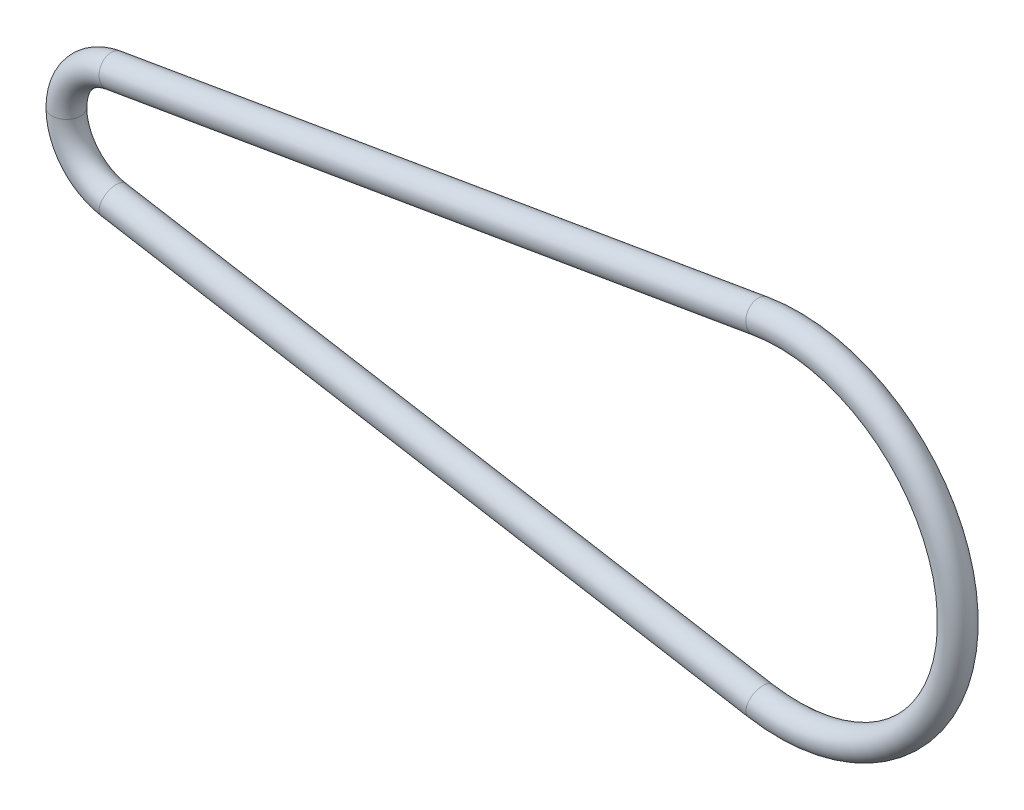
ISO-10303-21;
HEADER;
FILE_DESCRIPTION(('STEP AP214'),'2;1');
FILE_NAME('part.step','',(''),(''),'','','');
FILE_SCHEMA(('AUTOMOTIVE_DESIGN { 1 0 10303 214 1 1 1 1 }'));
ENDSEC;
DATA;
#1=APPLICATION_CONTEXT('core data for automotive mechanical design processes');
#2=APPLICATION_PROTOCOL_DEFINITION('international standard','automotive_design',2000,#1);
#3=PRODUCT_CONTEXT('',#1,'mechanical');
#4=PRODUCT('Part','Part','',(#3));
#5=PRODUCT_RELATED_PRODUCT_CATEGORY('part','',(#4));
#6=PRODUCT_DEFINITION_FORMATION('','',#4);
#7=PRODUCT_DEFINITION_CONTEXT('part definition',#1,'design');
#8=PRODUCT_DEFINITION('design','',#6,#7);
#9=PRODUCT_DEFINITION_SHAPE('','',#8);
#10=(LENGTH_UNIT() NAMED_UNIT(*) SI_UNIT(.MILLI.,.METRE.));
#11=(NAMED_UNIT(*) PLANE_ANGLE_UNIT() SI_UNIT($,.RADIAN.));
#12=(NAMED_UNIT(*) SI_UNIT($,.STERADIAN.) SOLID_ANGLE_UNIT());
#13=UNCERTAINTY_MEASURE_WITH_UNIT(LENGTH_MEASURE(1.E-05),#10,'distance_accuracy_value','');
#14=(GEOMETRIC_REPRESENTATION_CONTEXT(3) GLOBAL_UNCERTAINTY_ASSIGNED_CONTEXT((#13)) GLOBAL_UNIT_ASSIGNED_CONTEXT((#10,
#11,#12)) REPRESENTATION_CONTEXT('',''));
#15=CARTESIAN_POINT('',(0.,0.,0.));
#16=DIRECTION('',(0.,0.,1.));
#17=DIRECTION('',(1.,0.,0.));
#18=AXIS2_PLACEMENT_3D('',#15,#16,#17);
#19=CARTESIAN_POINT('',(0.,0.,0.));
#20=DIRECTION('',(0.,0.,-1.));
#21=DIRECTION('',(-1.,0.,0.));
#22=AXIS2_PLACEMENT_3D('',#19,#20,#21);
#23=TOROIDAL_SURFACE('',#22,5.1562,1.3081);
#24=CARTESIAN_POINT('',(-0.868102245170301,-5.08259745916695,0.));
#25=DIRECTION('',(-0.98572542941836,0.168360855895873,0.));
#26=DIRECTION('',(0.,0.,1.));
#27=AXIS2_PLACEMENT_3D('',#24,#25,#26);
#28=CIRCLE('',#27,1.3081);
#29=CARTESIAN_POINT('',(-1.08833508076769,-6.3720248933891,0.));
#30=VERTEX_POINT('',#29);
#31=EDGE_CURVE('E10',#30,#30,#28,.T.);
#32=CARTESIAN_POINT('',(-5.1562,0.,0.));
#33=DIRECTION('',(0.,1.,0.));
#34=DIRECTION('',(0.,0.,1.));
#35=AXIS2_PLACEMENT_3D('',#32,#33,#34);
#36=CIRCLE('',#35,1.3081);
#37=CARTESIAN_POINT('',(-6.4643,0.,0.));
#38=VERTEX_POINT('',#37);
#39=EDGE_CURVE('E50',#38,#38,#36,.T.);
#40=CARTESIAN_POINT('',(0.,0.,0.));
#41=DIRECTION('',(0.,0.,-1.));
#42=DIRECTION('',(-1.,0.,0.));
#43=AXIS2_PLACEMENT_3D('',#40,#41,#42);
#44=CIRCLE('',#43,6.4643);
#45=EDGE_CURVE('',#30,#38,#44,.T.);
#46=ORIENTED_EDGE('',*,*,#31,.T.);
#47=ORIENTED_EDGE('',*,*,#39,.F.);
#48=ORIENTED_EDGE('',*,*,#45,.T.);
#49=ORIENTED_EDGE('',*,*,#45,.F.);
#50=EDGE_LOOP('',(#46,#48,#47,#49));
#51=FACE_BOUND('',#50,.T.);
#52=ADVANCED_FACE('F31',(#51),#23,.T.);
#53=CARTESIAN_POINT('',(57.7679204160474,-15.0975678220575,0.));
#54=DIRECTION('',(-0.985725429418359,0.168360855895873,0.));
#55=DIRECTION('',(-0.168360855895873,-0.985725429418359,0.));
#56=AXIS2_PLACEMENT_3D('',#53,#54,#55);
#57=CYLINDRICAL_SURFACE('',#56,1.3081);
#58=ORIENTED_EDGE('',*,*,#31,.F.);
#59=EDGE_LOOP('',(#58));
#60=FACE_BOUND('',#59,.T.);
#61=CARTESIAN_POINT('',(57.7679204160474,-15.0975678220575,0.));
#62=DIRECTION('',(-0.98572542941836,0.168360855895872,0.));
#63=DIRECTION('',(0.,0.,1.));
#64=AXIS2_PLACEMENT_3D('',#61,#62,#63);
#65=CIRCLE('',#64,1.3081);
#66=CARTESIAN_POINT('',(57.54768758045,-16.3869952562796,0.));
#67=VERTEX_POINT('',#66);
#68=EDGE_CURVE('E37',#67,#67,#65,.T.);
#69=ORIENTED_EDGE('',*,*,#68,.T.);
#70=EDGE_LOOP('',(#69));
#71=FACE_BOUND('',#70,.T.);
#72=ADVANCED_FACE('F57',(#60,#71),#57,.T.);
#73=CARTESIAN_POINT('',(60.3465689571197,0.,0.));
#74=DIRECTION('',(0.,0.,-1.));
#75=DIRECTION('',(-1.,0.,0.));
#76=AXIS2_PLACEMENT_3D('',#73,#74,#75);
#77=TOROIDAL_SURFACE('',#76,15.3162,1.3081);
#78=CARTESIAN_POINT('',(57.7679204160474,15.0975678220575,0.));
#79=DIRECTION('',(0.98572542941836,0.168360855895873,0.));
#80=DIRECTION('',(0.,0.,1.));
#81=AXIS2_PLACEMENT_3D('',#78,#79,#80);
#82=CIRCLE('',#81,1.3081);
#83=CARTESIAN_POINT('',(57.54768758045,16.3869952562796,0.));
#84=VERTEX_POINT('',#83);
#85=EDGE_CURVE('E41',#84,#84,#82,.T.);
#86=CARTESIAN_POINT('',(60.3465689571197,0.,0.));
#87=DIRECTION('',(0.,0.,-1.));
#88=DIRECTION('',(-1.,0.,0.));
#89=AXIS2_PLACEMENT_3D('',#86,#87,#88);
#90=CIRCLE('',#89,16.6243);
#91=EDGE_CURVE('',#84,#67,#90,.T.);
#92=ORIENTED_EDGE('',*,*,#85,.T.);
#93=ORIENTED_EDGE('',*,*,#68,.F.);
#94=ORIENTED_EDGE('',*,*,#91,.T.);
#95=ORIENTED_EDGE('',*,*,#91,.F.);
#96=EDGE_LOOP('',(#92,#94,#93,#95));
#97=FACE_BOUND('',#96,.T.);
#98=ADVANCED_FACE('F61',(#97),#77,.T.);
#99=CARTESIAN_POINT('',(-0.868102245170301,5.08259745916695,0.));
#100=DIRECTION('',(0.985725429418359,0.168360855895873,0.));
#101=DIRECTION('',(-0.168360855895873,0.985725429418359,0.));
#102=AXIS2_PLACEMENT_3D('',#99,#100,#101);
#103=CYLINDRICAL_SURFACE('',#102,1.3081);
#104=ORIENTED_EDGE('',*,*,#85,.F.);
#105=EDGE_LOOP('',(#104));
#106=FACE_BOUND('',#105,.T.);
#107=CARTESIAN_POINT('',(-0.868102245170301,5.08259745916695,0.));
#108=DIRECTION('',(0.985725429418359,0.168360855895873,0.));
#109=DIRECTION('',(0.,0.,1.));
#110=AXIS2_PLACEMENT_3D('',#107,#108,#109);
#111=CIRCLE('',#110,1.3081);
#112=CARTESIAN_POINT('',(-1.08833508076769,6.3720248933891,0.));
#113=VERTEX_POINT('',#112);
#114=EDGE_CURVE('E45',#113,#113,#111,.T.);
#115=ORIENTED_EDGE('',*,*,#114,.T.);
#116=EDGE_LOOP('',(#115));
#117=FACE_BOUND('',#116,.T.);
#118=ADVANCED_FACE('F66',(#106,#117),#103,.T.);
#119=CARTESIAN_POINT('',(0.,0.,0.));
#120=DIRECTION('',(0.,0.,-1.));
#121=DIRECTION('',(-1.,0.,0.));
#122=AXIS2_PLACEMENT_3D('',#119,#120,#121);
#123=TOROIDAL_SURFACE('',#122,5.1562,1.3081);
#124=CARTESIAN_POINT('',(0.,0.,0.));
#125=DIRECTION('',(0.,0.,-1.));
#126=DIRECTION('',(-1.,0.,0.));
#127=AXIS2_PLACEMENT_3D('',#124,#125,#126);
#128=CIRCLE('',#127,6.4643);
#129=EDGE_CURVE('',#38,#113,#128,.T.);
#130=ORIENTED_EDGE('',*,*,#39,.T.);
#131=ORIENTED_EDGE('',*,*,#114,.F.);
#132=ORIENTED_EDGE('',*,*,#129,.T.);
#133=ORIENTED_EDGE('',*,*,#129,.F.);
#134=EDGE_LOOP('',(#130,#132,#131,#133));
#135=FACE_BOUND('',#134,.T.);
#136=ADVANCED_FACE('F54',(#135),#123,.T.);
#137=CLOSED_SHELL('',(#52,#72,#98,#118,#136));
#138=MANIFOLD_SOLID_BREP('B2',#137);
#139=ADVANCED_BREP_SHAPE_REPRESENTATION('',(#18,#138),#14);
#140=SHAPE_DEFINITION_REPRESENTATION(#9,#139);
ENDSEC;
END-ISO-10303-21;
